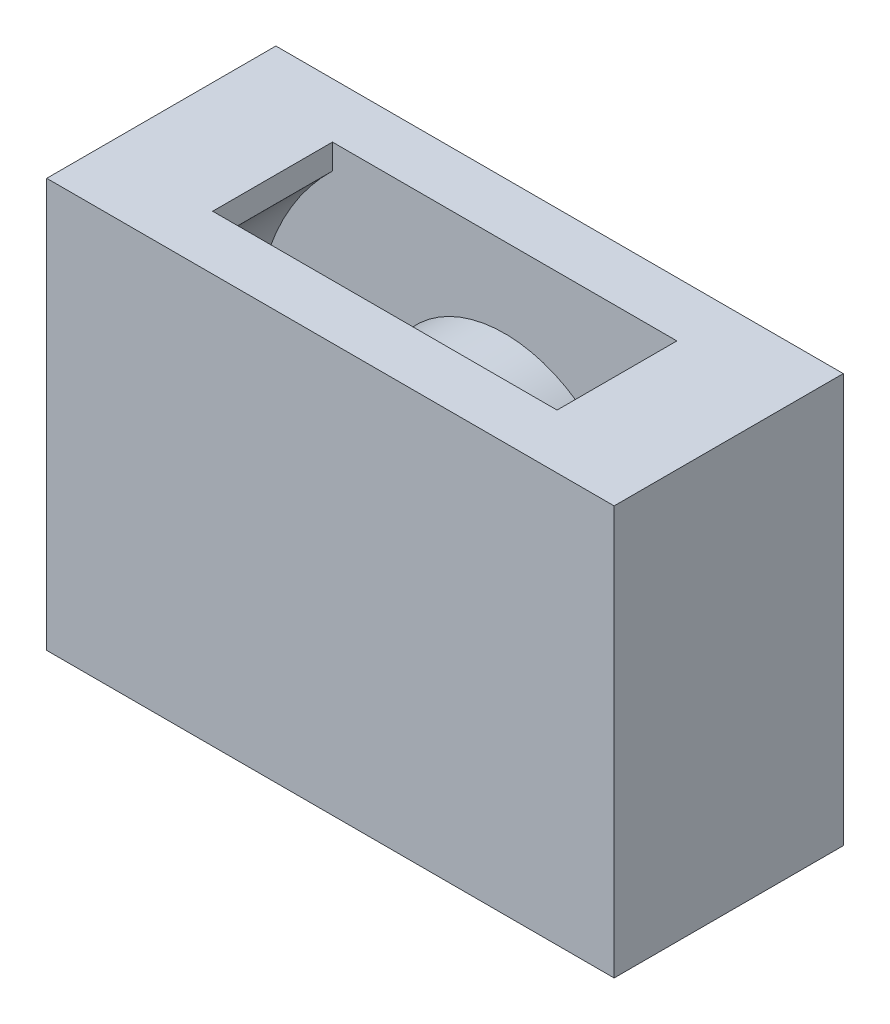
ISO-10303-21;
HEADER;
FILE_DESCRIPTION(('STEP AP214'),'2;1');
FILE_NAME('part.step','',(''),(''),'','','');
FILE_SCHEMA(('AUTOMOTIVE_DESIGN { 1 0 10303 214 1 1 1 1 }'));
ENDSEC;
DATA;
#1=APPLICATION_CONTEXT('core data for automotive mechanical design processes');
#2=APPLICATION_PROTOCOL_DEFINITION('international standard','automotive_design',2000,#1);
#3=PRODUCT_CONTEXT('',#1,'mechanical');
#4=PRODUCT('Part','Part','',(#3));
#5=PRODUCT_RELATED_PRODUCT_CATEGORY('part','',(#4));
#6=PRODUCT_DEFINITION_FORMATION('','',#4);
#7=PRODUCT_DEFINITION_CONTEXT('part definition',#1,'design');
#8=PRODUCT_DEFINITION('design','',#6,#7);
#9=PRODUCT_DEFINITION_SHAPE('','',#8);
#10=(LENGTH_UNIT() NAMED_UNIT(*) SI_UNIT(.MILLI.,.METRE.));
#11=(NAMED_UNIT(*) PLANE_ANGLE_UNIT() SI_UNIT($,.RADIAN.));
#12=(NAMED_UNIT(*) SI_UNIT($,.STERADIAN.) SOLID_ANGLE_UNIT());
#13=UNCERTAINTY_MEASURE_WITH_UNIT(LENGTH_MEASURE(1.E-05),#10,'distance_accuracy_value','');
#14=(GEOMETRIC_REPRESENTATION_CONTEXT(3) GLOBAL_UNCERTAINTY_ASSIGNED_CONTEXT((#13)) GLOBAL_UNIT_ASSIGNED_CONTEXT((#10,
#11,#12)) REPRESENTATION_CONTEXT('',''));
#15=CARTESIAN_POINT('',(0.,0.,0.));
#16=DIRECTION('',(0.,0.,1.));
#17=DIRECTION('',(1.,0.,0.));
#18=AXIS2_PLACEMENT_3D('',#15,#16,#17);
#19=CARTESIAN_POINT('',(12.455,-8.975,7.65));
#20=DIRECTION('',(-1.,0.,0.));
#21=DIRECTION('',(0.,0.,1.));
#22=AXIS2_PLACEMENT_3D('',#19,#20,#21);
#23=PLANE('',#22);
#24=DIRECTION('',(0.,0.,-1.));
#25=VECTOR('',#24,1.);
#26=CARTESIAN_POINT('',(12.455,-8.975,7.65));
#27=LINE('',#26,#25);
#28=CARTESIAN_POINT('',(12.455,-8.975,7.65));
#29=VERTEX_POINT('',#28);
#30=CARTESIAN_POINT('',(12.455,-8.975,-2.41));
#31=VERTEX_POINT('',#30);
#32=EDGE_CURVE('E132',#29,#31,#27,.T.);
#33=ORIENTED_EDGE('',*,*,#32,.T.);
#34=DIRECTION('',(0.,1.,0.));
#35=VECTOR('',#34,1.);
#36=CARTESIAN_POINT('',(12.455,-8.975,-2.41));
#37=LINE('',#36,#35);
#38=CARTESIAN_POINT('',(12.455,8.975,-2.41));
#39=VERTEX_POINT('',#38);
#40=EDGE_CURVE('E142',#31,#39,#37,.T.);
#41=ORIENTED_EDGE('',*,*,#40,.T.);
#42=DIRECTION('',(0.,0.,-1.));
#43=VECTOR('',#42,1.);
#44=CARTESIAN_POINT('',(12.455,8.975,7.65));
#45=LINE('',#44,#43);
#46=CARTESIAN_POINT('',(12.455,8.975,7.65));
#47=VERTEX_POINT('',#46);
#48=EDGE_CURVE('E44',#47,#39,#45,.T.);
#49=ORIENTED_EDGE('',*,*,#48,.F.);
#50=DIRECTION('',(0.,1.,0.));
#51=VECTOR('',#50,1.);
#52=CARTESIAN_POINT('',(12.455,-8.975,7.65));
#53=LINE('',#52,#51);
#54=EDGE_CURVE('E203',#29,#47,#53,.T.);
#55=ORIENTED_EDGE('',*,*,#54,.F.);
#56=EDGE_LOOP('',(#33,#41,#49,#55));
#57=FACE_BOUND('',#56,.T.);
#58=ADVANCED_FACE('F37',(#57),#23,.F.);
#59=CARTESIAN_POINT('',(-12.455,8.975,7.65));
#60=DIRECTION('',(0.,-1.,0.));
#61=DIRECTION('',(0.,0.,-1.));
#62=AXIS2_PLACEMENT_3D('',#59,#60,#61);
#63=PLANE('',#62);
#64=DIRECTION('',(-1.,0.,0.));
#65=VECTOR('',#64,1.);
#66=CARTESIAN_POINT('',(12.455,8.975,0.));
#67=LINE('',#66,#65);
#68=CARTESIAN_POINT('',(7.56,8.975,0.));
#69=VERTEX_POINT('',#68);
#70=CARTESIAN_POINT('',(-7.55999999999994,8.975,0.));
#71=VERTEX_POINT('',#70);
#72=EDGE_CURVE('E146',#69,#71,#67,.T.);
#73=ORIENTED_EDGE('',*,*,#72,.F.);
#74=DIRECTION('',(0.,0.,-1.));
#75=VECTOR('',#74,1.);
#76=CARTESIAN_POINT('',(7.56,8.975,5.26));
#77=LINE('',#76,#75);
#78=CARTESIAN_POINT('',(7.56,8.975,5.26));
#79=VERTEX_POINT('',#78);
#80=EDGE_CURVE('E216',#79,#69,#77,.T.);
#81=ORIENTED_EDGE('',*,*,#80,.F.);
#82=DIRECTION('',(1.,0.,0.));
#83=VECTOR('',#82,1.);
#84=CARTESIAN_POINT('',(-7.55999999999994,8.975,5.26));
#85=LINE('',#84,#83);
#86=CARTESIAN_POINT('',(-7.55999999999994,8.975,5.26));
#87=VERTEX_POINT('',#86);
#88=EDGE_CURVE('E166',#87,#79,#85,.T.);
#89=ORIENTED_EDGE('',*,*,#88,.F.);
#90=DIRECTION('',(0.,0.,-1.));
#91=VECTOR('',#90,1.);
#92=CARTESIAN_POINT('',(-7.55999999999994,8.975,5.26));
#93=LINE('',#92,#91);
#94=EDGE_CURVE('E219',#87,#71,#93,.T.);
#95=ORIENTED_EDGE('',*,*,#94,.T.);
#96=EDGE_LOOP('',(#73,#81,#89,#95));
#97=FACE_BOUND('',#96,.T.);
#98=ORIENTED_EDGE('',*,*,#48,.T.);
#99=DIRECTION('',(-1.,0.,0.));
#100=VECTOR('',#99,1.);
#101=CARTESIAN_POINT('',(12.455,8.975,-2.41));
#102=LINE('',#101,#100);
#103=CARTESIAN_POINT('',(-12.455,8.975,-2.41));
#104=VERTEX_POINT('',#103);
#105=EDGE_CURVE('E152',#39,#104,#102,.T.);
#106=ORIENTED_EDGE('',*,*,#105,.T.);
#107=DIRECTION('',(0.,0.,-1.));
#108=VECTOR('',#107,1.);
#109=CARTESIAN_POINT('',(-12.455,8.975,7.65));
#110=LINE('',#109,#108);
#111=CARTESIAN_POINT('',(-12.455,8.975,7.65));
#112=VERTEX_POINT('',#111);
#113=EDGE_CURVE('E131',#112,#104,#110,.T.);
#114=ORIENTED_EDGE('',*,*,#113,.F.);
#115=DIRECTION('',(-1.,0.,0.));
#116=VECTOR('',#115,1.);
#117=CARTESIAN_POINT('',(-12.455,8.975,7.65));
#118=LINE('',#117,#116);
#119=EDGE_CURVE('E225',#47,#112,#118,.T.);
#120=ORIENTED_EDGE('',*,*,#119,.F.);
#121=EDGE_LOOP('',(#98,#106,#114,#120));
#122=FACE_BOUND('',#121,.T.);
#123=ADVANCED_FACE('F232',(#97,#122),#63,.F.);
#124=CARTESIAN_POINT('',(-12.455,-8.975,7.65));
#125=DIRECTION('',(1.,0.,0.));
#126=DIRECTION('',(0.,0.,-1.));
#127=AXIS2_PLACEMENT_3D('',#124,#125,#126);
#128=PLANE('',#127);
#129=ORIENTED_EDGE('',*,*,#113,.T.);
#130=DIRECTION('',(0.,-1.,0.));
#131=VECTOR('',#130,1.);
#132=CARTESIAN_POINT('',(-12.455,-8.975,-2.41));
#133=LINE('',#132,#131);
#134=CARTESIAN_POINT('',(-12.455,-8.975,-2.41));
#135=VERTEX_POINT('',#134);
#136=EDGE_CURVE('E139',#104,#135,#133,.T.);
#137=ORIENTED_EDGE('',*,*,#136,.T.);
#138=DIRECTION('',(0.,0.,-1.));
#139=VECTOR('',#138,1.);
#140=CARTESIAN_POINT('',(-12.455,-8.975,7.65));
#141=LINE('',#140,#139);
#142=CARTESIAN_POINT('',(-12.455,-8.975,7.65));
#143=VERTEX_POINT('',#142);
#144=EDGE_CURVE('E124',#143,#135,#141,.T.);
#145=ORIENTED_EDGE('',*,*,#144,.F.);
#146=DIRECTION('',(0.,-1.,0.));
#147=VECTOR('',#146,1.);
#148=CARTESIAN_POINT('',(-12.455,-8.975,7.65));
#149=LINE('',#148,#147);
#150=EDGE_CURVE('E56',#112,#143,#149,.T.);
#151=ORIENTED_EDGE('',*,*,#150,.F.);
#152=EDGE_LOOP('',(#129,#137,#145,#151));
#153=FACE_BOUND('',#152,.T.);
#154=ADVANCED_FACE('F144',(#153),#128,.F.);
#155=CARTESIAN_POINT('',(-12.455,-8.975,7.65));
#156=DIRECTION('',(0.,1.,0.));
#157=DIRECTION('',(0.,0.,1.));
#158=AXIS2_PLACEMENT_3D('',#155,#156,#157);
#159=PLANE('',#158);
#160=DIRECTION('',(1.,0.,0.));
#161=VECTOR('',#160,1.);
#162=CARTESIAN_POINT('',(12.455,-8.975,-2.41));
#163=LINE('',#162,#161);
#164=EDGE_CURVE('E128',#135,#31,#163,.T.);
#165=ORIENTED_EDGE('',*,*,#164,.T.);
#166=ORIENTED_EDGE('',*,*,#32,.F.);
#167=DIRECTION('',(1.,0.,0.));
#168=VECTOR('',#167,1.);
#169=CARTESIAN_POINT('',(-12.455,-8.975,7.65));
#170=LINE('',#169,#168);
#171=EDGE_CURVE('E51',#143,#29,#170,.T.);
#172=ORIENTED_EDGE('',*,*,#171,.F.);
#173=ORIENTED_EDGE('',*,*,#144,.T.);
#174=EDGE_LOOP('',(#165,#166,#172,#173));
#175=FACE_BOUND('',#174,.T.);
#176=DIRECTION('',(0.,0.,-1.));
#177=VECTOR('',#176,1.);
#178=CARTESIAN_POINT('',(7.56,-8.97500000002463,5.26));
#179=LINE('',#178,#177);
#180=CARTESIAN_POINT('',(7.56,-8.97500000002463,5.26));
#181=VERTEX_POINT('',#180);
#182=CARTESIAN_POINT('',(7.56,-8.975,0.));
#183=VERTEX_POINT('',#182);
#184=EDGE_CURVE('E207',#181,#183,#179,.T.);
#185=ORIENTED_EDGE('',*,*,#184,.T.);
#186=DIRECTION('',(1.,0.,0.));
#187=VECTOR('',#186,1.);
#188=CARTESIAN_POINT('',(12.455,-8.975,0.));
#189=LINE('',#188,#187);
#190=CARTESIAN_POINT('',(-7.56000000000006,-8.975,0.));
#191=VERTEX_POINT('',#190);
#192=EDGE_CURVE('E148',#191,#183,#189,.T.);
#193=ORIENTED_EDGE('',*,*,#192,.F.);
#194=DIRECTION('',(0.,0.,-1.));
#195=VECTOR('',#194,1.);
#196=CARTESIAN_POINT('',(-7.56000000000006,-8.97500000002463,5.26));
#197=LINE('',#196,#195);
#198=CARTESIAN_POINT('',(-7.56000000000006,-8.97500000002463,5.26));
#199=VERTEX_POINT('',#198);
#200=EDGE_CURVE('E204',#199,#191,#197,.T.);
#201=ORIENTED_EDGE('',*,*,#200,.F.);
#202=DIRECTION('',(-1.,0.,0.));
#203=VECTOR('',#202,1.);
#204=CARTESIAN_POINT('',(-7.56000000000006,-8.97500000002463,5.26));
#205=LINE('',#204,#203);
#206=EDGE_CURVE('E178',#181,#199,#205,.T.);
#207=ORIENTED_EDGE('',*,*,#206,.F.);
#208=EDGE_LOOP('',(#185,#193,#201,#207));
#209=FACE_BOUND('',#208,.T.);
#210=ADVANCED_FACE('F126',(#175,#209),#159,.F.);
#211=CARTESIAN_POINT('',(0.,0.,7.65));
#212=DIRECTION('',(0.,0.,-1.));
#213=DIRECTION('',(-1.,0.,0.));
#214=AXIS2_PLACEMENT_3D('',#211,#212,#213);
#215=PLANE('',#214);
#216=ORIENTED_EDGE('',*,*,#54,.T.);
#217=ORIENTED_EDGE('',*,*,#119,.T.);
#218=ORIENTED_EDGE('',*,*,#150,.T.);
#219=ORIENTED_EDGE('',*,*,#171,.T.);
#220=EDGE_LOOP('',(#216,#217,#218,#219));
#221=FACE_BOUND('',#220,.T.);
#222=ADVANCED_FACE('F235',(#221),#215,.F.);
#223=CARTESIAN_POINT('',(0.,0.,5.26));
#224=DIRECTION('',(0.,0.,-1.));
#225=DIRECTION('',(-1.,0.,0.));
#226=AXIS2_PLACEMENT_3D('',#223,#224,#225);
#227=CYLINDRICAL_SURFACE('',#226,10.915);
#228=CARTESIAN_POINT('',(0.,0.,0.));
#229=DIRECTION('',(0.,0.,-1.));
#230=DIRECTION('',(-1.,0.,0.));
#231=AXIS2_PLACEMENT_3D('',#228,#229,#230);
#232=CIRCLE('',#231,10.915);
#233=CARTESIAN_POINT('',(-7.56000000000005,-7.87296799180583,0.));
#234=VERTEX_POINT('',#233);
#235=CARTESIAN_POINT('',(-7.55999999999995,7.87296799180594,0.));
#236=VERTEX_POINT('',#235);
#237=EDGE_CURVE('E158',#234,#236,#232,.T.);
#238=ORIENTED_EDGE('',*,*,#237,.T.);
#239=DIRECTION('',(0.,0.,-1.));
#240=VECTOR('',#239,1.);
#241=CARTESIAN_POINT('',(-7.55999999999995,7.87296799180594,5.26));
#242=LINE('',#241,#240);
#243=CARTESIAN_POINT('',(-7.55999999999995,7.87296799180594,5.26));
#244=VERTEX_POINT('',#243);
#245=EDGE_CURVE('E183',#244,#236,#242,.T.);
#246=ORIENTED_EDGE('',*,*,#245,.F.);
#247=CARTESIAN_POINT('',(0.,0.,5.26));
#248=DIRECTION('',(0.,0.,-1.));
#249=DIRECTION('',(-1.,0.,0.));
#250=AXIS2_PLACEMENT_3D('',#247,#248,#249);
#251=CIRCLE('',#250,10.915);
#252=CARTESIAN_POINT('',(-7.56000000000005,-7.87296799180583,5.26));
#253=VERTEX_POINT('',#252);
#254=EDGE_CURVE('E159',#253,#244,#251,.T.);
#255=ORIENTED_EDGE('',*,*,#254,.F.);
#256=DIRECTION('',(0.,0.,-1.));
#257=VECTOR('',#256,1.);
#258=CARTESIAN_POINT('',(-7.56000000000005,-7.87296799180583,5.26));
#259=LINE('',#258,#257);
#260=EDGE_CURVE('E200',#253,#234,#259,.T.);
#261=ORIENTED_EDGE('',*,*,#260,.T.);
#262=EDGE_LOOP('',(#238,#246,#255,#261));
#263=FACE_BOUND('',#262,.T.);
#264=ADVANCED_FACE('F237',(#263),#227,.F.);
#265=CARTESIAN_POINT('',(-7.56000000000006,-8.97500000002463,5.26));
#266=DIRECTION('',(-1.,0.,0.));
#267=DIRECTION('',(0.,-1.,0.));
#268=AXIS2_PLACEMENT_3D('',#265,#266,#267);
#269=PLANE('',#268);
#270=DIRECTION('',(0.,1.,0.));
#271=VECTOR('',#270,1.);
#272=CARTESIAN_POINT('',(-7.56000000000006,-8.97500000002463,0.));
#273=LINE('',#272,#271);
#274=EDGE_CURVE('E163',#191,#234,#273,.T.);
#275=ORIENTED_EDGE('',*,*,#274,.T.);
#276=ORIENTED_EDGE('',*,*,#260,.F.);
#277=DIRECTION('',(0.,1.,0.));
#278=VECTOR('',#277,1.);
#279=CARTESIAN_POINT('',(-7.56000000000006,-8.97500000002463,5.26));
#280=LINE('',#279,#278);
#281=EDGE_CURVE('E180',#199,#253,#280,.T.);
#282=ORIENTED_EDGE('',*,*,#281,.F.);
#283=ORIENTED_EDGE('',*,*,#200,.T.);
#284=EDGE_LOOP('',(#275,#276,#282,#283));
#285=FACE_BOUND('',#284,.T.);
#286=ADVANCED_FACE('F243',(#285),#269,.F.);
#287=CARTESIAN_POINT('',(7.56,-8.97500000002463,5.26));
#288=DIRECTION('',(1.,0.,0.));
#289=DIRECTION('',(0.,1.,0.));
#290=AXIS2_PLACEMENT_3D('',#287,#288,#289);
#291=PLANE('',#290);
#292=DIRECTION('',(0.,-1.,0.));
#293=VECTOR('',#292,1.);
#294=CARTESIAN_POINT('',(7.56,-8.97500000002463,0.));
#295=LINE('',#294,#293);
#296=CARTESIAN_POINT('',(7.56,-7.87296799180588,0.));
#297=VERTEX_POINT('',#296);
#298=EDGE_CURVE('E195',#297,#183,#295,.T.);
#299=ORIENTED_EDGE('',*,*,#298,.T.);
#300=ORIENTED_EDGE('',*,*,#184,.F.);
#301=DIRECTION('',(0.,-1.,0.));
#302=VECTOR('',#301,1.);
#303=CARTESIAN_POINT('',(7.56,-8.97500000002463,5.26));
#304=LINE('',#303,#302);
#305=CARTESIAN_POINT('',(7.56,-7.87296799180588,5.26));
#306=VERTEX_POINT('',#305);
#307=EDGE_CURVE('E175',#306,#181,#304,.T.);
#308=ORIENTED_EDGE('',*,*,#307,.F.);
#309=DIRECTION('',(0.,0.,-1.));
#310=VECTOR('',#309,1.);
#311=CARTESIAN_POINT('',(7.56,-7.87296799180588,5.26));
#312=LINE('',#311,#310);
#313=EDGE_CURVE('E210',#306,#297,#312,.T.);
#314=ORIENTED_EDGE('',*,*,#313,.T.);
#315=EDGE_LOOP('',(#299,#300,#308,#314));
#316=FACE_BOUND('',#315,.T.);
#317=ADVANCED_FACE('F278',(#316),#291,.F.);
#318=CARTESIAN_POINT('',(0.,0.,5.26));
#319=DIRECTION('',(0.,0.,-1.));
#320=DIRECTION('',(-1.,0.,0.));
#321=AXIS2_PLACEMENT_3D('',#318,#319,#320);
#322=CYLINDRICAL_SURFACE('',#321,10.915);
#323=CARTESIAN_POINT('',(0.,0.,0.));
#324=DIRECTION('',(0.,0.,-1.));
#325=DIRECTION('',(-1.,0.,0.));
#326=AXIS2_PLACEMENT_3D('',#323,#324,#325);
#327=CIRCLE('',#326,10.915);
#328=CARTESIAN_POINT('',(7.56,7.87296799180589,0.));
#329=VERTEX_POINT('',#328);
#330=EDGE_CURVE('E192',#329,#297,#327,.T.);
#331=ORIENTED_EDGE('',*,*,#330,.T.);
#332=ORIENTED_EDGE('',*,*,#313,.F.);
#333=CARTESIAN_POINT('',(0.,0.,5.26));
#334=DIRECTION('',(0.,0.,-1.));
#335=DIRECTION('',(-1.,0.,0.));
#336=AXIS2_PLACEMENT_3D('',#333,#334,#335);
#337=CIRCLE('',#336,10.915);
#338=CARTESIAN_POINT('',(7.56,7.87296799180589,5.26));
#339=VERTEX_POINT('',#338);
#340=EDGE_CURVE('E172',#339,#306,#337,.T.);
#341=ORIENTED_EDGE('',*,*,#340,.F.);
#342=DIRECTION('',(0.,0.,-1.));
#343=VECTOR('',#342,1.);
#344=CARTESIAN_POINT('',(7.56,7.87296799180589,5.26));
#345=LINE('',#344,#343);
#346=EDGE_CURVE('E213',#339,#329,#345,.T.);
#347=ORIENTED_EDGE('',*,*,#346,.T.);
#348=EDGE_LOOP('',(#331,#332,#341,#347));
#349=FACE_BOUND('',#348,.T.);
#350=ADVANCED_FACE('F280',(#349),#322,.F.);
#351=CARTESIAN_POINT('',(7.56,7.87296799180589,5.26));
#352=DIRECTION('',(1.,0.,0.));
#353=DIRECTION('',(0.,0.,-1.));
#354=AXIS2_PLACEMENT_3D('',#351,#352,#353);
#355=PLANE('',#354);
#356=DIRECTION('',(0.,-1.,0.));
#357=VECTOR('',#356,1.);
#358=CARTESIAN_POINT('',(7.56,7.87296799180589,0.));
#359=LINE('',#358,#357);
#360=EDGE_CURVE('E189',#69,#329,#359,.T.);
#361=ORIENTED_EDGE('',*,*,#360,.T.);
#362=ORIENTED_EDGE('',*,*,#346,.F.);
#363=DIRECTION('',(0.,-1.,0.));
#364=VECTOR('',#363,1.);
#365=CARTESIAN_POINT('',(7.56,7.87296799180589,5.26));
#366=LINE('',#365,#364);
#367=EDGE_CURVE('E169',#79,#339,#366,.T.);
#368=ORIENTED_EDGE('',*,*,#367,.F.);
#369=ORIENTED_EDGE('',*,*,#80,.T.);
#370=EDGE_LOOP('',(#361,#362,#368,#369));
#371=FACE_BOUND('',#370,.T.);
#372=ADVANCED_FACE('F261',(#371),#355,.F.);
#373=CARTESIAN_POINT('',(-7.55999999999995,7.87296799180594,5.26));
#374=DIRECTION('',(-1.,0.,0.));
#375=DIRECTION('',(0.,-1.,0.));
#376=AXIS2_PLACEMENT_3D('',#373,#374,#375);
#377=PLANE('',#376);
#378=DIRECTION('',(0.,1.,0.));
#379=VECTOR('',#378,1.);
#380=CARTESIAN_POINT('',(-7.55999999999995,7.87296799180594,0.));
#381=LINE('',#380,#379);
#382=EDGE_CURVE('E186',#236,#71,#381,.T.);
#383=ORIENTED_EDGE('',*,*,#382,.T.);
#384=ORIENTED_EDGE('',*,*,#94,.F.);
#385=DIRECTION('',(0.,1.,0.));
#386=VECTOR('',#385,1.);
#387=CARTESIAN_POINT('',(-7.55999999999995,7.87296799180594,5.26));
#388=LINE('',#387,#386);
#389=EDGE_CURVE('E162',#244,#87,#388,.T.);
#390=ORIENTED_EDGE('',*,*,#389,.F.);
#391=ORIENTED_EDGE('',*,*,#245,.T.);
#392=EDGE_LOOP('',(#383,#384,#390,#391));
#393=FACE_BOUND('',#392,.T.);
#394=ADVANCED_FACE('F268',(#393),#377,.F.);
#395=CARTESIAN_POINT('',(0.,0.,5.26));
#396=DIRECTION('',(0.,0.,-1.));
#397=DIRECTION('',(-1.,0.,0.));
#398=AXIS2_PLACEMENT_3D('',#395,#396,#397);
#399=PLANE('',#398);
#400=CARTESIAN_POINT('',(0.,0.,5.26));
#401=DIRECTION('',(0.,0.,-1.));
#402=DIRECTION('',(-1.,0.,0.));
#403=AXIS2_PLACEMENT_3D('',#400,#401,#402);
#404=CIRCLE('',#403,5.48);
#405=CARTESIAN_POINT('',(-5.48,0.,5.26));
#406=VERTEX_POINT('',#405);
#407=EDGE_CURVE('E11',#406,#406,#404,.T.);
#408=ORIENTED_EDGE('',*,*,#407,.F.);
#409=EDGE_LOOP('',(#408));
#410=FACE_BOUND('',#409,.T.);
#411=ORIENTED_EDGE('',*,*,#254,.T.);
#412=ORIENTED_EDGE('',*,*,#389,.T.);
#413=ORIENTED_EDGE('',*,*,#88,.T.);
#414=ORIENTED_EDGE('',*,*,#367,.T.);
#415=ORIENTED_EDGE('',*,*,#340,.T.);
#416=ORIENTED_EDGE('',*,*,#307,.T.);
#417=ORIENTED_EDGE('',*,*,#206,.T.);
#418=ORIENTED_EDGE('',*,*,#281,.T.);
#419=EDGE_LOOP('',(#411,#412,#413,#414,#415,#416,#417,#418));
#420=FACE_BOUND('',#419,.T.);
#421=ADVANCED_FACE('F264',(#410,#420),#399,.T.);
#422=CARTESIAN_POINT('',(0.,0.,0.));
#423=DIRECTION('',(0.,0.,1.));
#424=DIRECTION('',(1.,0.,0.));
#425=AXIS2_PLACEMENT_3D('',#422,#423,#424);
#426=CYLINDRICAL_SURFACE('',#425,5.48);
#427=ORIENTED_EDGE('',*,*,#407,.T.);
#428=EDGE_LOOP('',(#427));
#429=FACE_BOUND('',#428,.T.);
#430=CARTESIAN_POINT('',(0.,0.,0.));
#431=DIRECTION('',(0.,0.,1.));
#432=DIRECTION('',(1.,0.,0.));
#433=AXIS2_PLACEMENT_3D('',#430,#431,#432);
#434=CIRCLE('',#433,5.48);
#435=CARTESIAN_POINT('',(5.48,0.,0.));
#436=VERTEX_POINT('',#435);
#437=EDGE_CURVE('E154',#436,#436,#434,.T.);
#438=ORIENTED_EDGE('',*,*,#437,.T.);
#439=EDGE_LOOP('',(#438));
#440=FACE_BOUND('',#439,.T.);
#441=ADVANCED_FACE('F295',(#429,#440),#426,.T.);
#442=CARTESIAN_POINT('',(0.,0.,0.));
#443=DIRECTION('',(0.,0.,1.));
#444=DIRECTION('',(1.,0.,0.));
#445=AXIS2_PLACEMENT_3D('',#442,#443,#444);
#446=PLANE('',#445);
#447=ORIENTED_EDGE('',*,*,#298,.F.);
#448=ORIENTED_EDGE('',*,*,#330,.F.);
#449=ORIENTED_EDGE('',*,*,#360,.F.);
#450=ORIENTED_EDGE('',*,*,#72,.T.);
#451=ORIENTED_EDGE('',*,*,#382,.F.);
#452=ORIENTED_EDGE('',*,*,#237,.F.);
#453=ORIENTED_EDGE('',*,*,#274,.F.);
#454=ORIENTED_EDGE('',*,*,#192,.T.);
#455=EDGE_LOOP('',(#447,#448,#449,#450,#451,#452,#453,#454));
#456=FACE_BOUND('',#455,.T.);
#457=ORIENTED_EDGE('',*,*,#437,.F.);
#458=EDGE_LOOP('',(#457));
#459=FACE_BOUND('',#458,.T.);
#460=ADVANCED_FACE('F269',(#456,#459),#446,.T.);
#461=CARTESIAN_POINT('',(0.,0.,-2.41));
#462=DIRECTION('',(0.,0.,1.));
#463=DIRECTION('',(1.,0.,0.));
#464=AXIS2_PLACEMENT_3D('',#461,#462,#463);
#465=PLANE('',#464);
#466=ORIENTED_EDGE('',*,*,#136,.F.);
#467=ORIENTED_EDGE('',*,*,#105,.F.);
#468=ORIENTED_EDGE('',*,*,#40,.F.);
#469=ORIENTED_EDGE('',*,*,#164,.F.);
#470=EDGE_LOOP('',(#466,#467,#468,#469));
#471=FACE_BOUND('',#470,.T.);
#472=ADVANCED_FACE('F137',(#471),#465,.F.);
#473=CLOSED_SHELL('',(#58,#123,#154,#210,#222,#264,#286,#317,#350,#372,#394,#421,#441,#460,#472));
#474=MANIFOLD_SOLID_BREP('B2',#473);
#475=ADVANCED_BREP_SHAPE_REPRESENTATION('',(#18,#474),#14);
#476=SHAPE_DEFINITION_REPRESENTATION(#9,#475);
ENDSEC;
END-ISO-10303-21;
